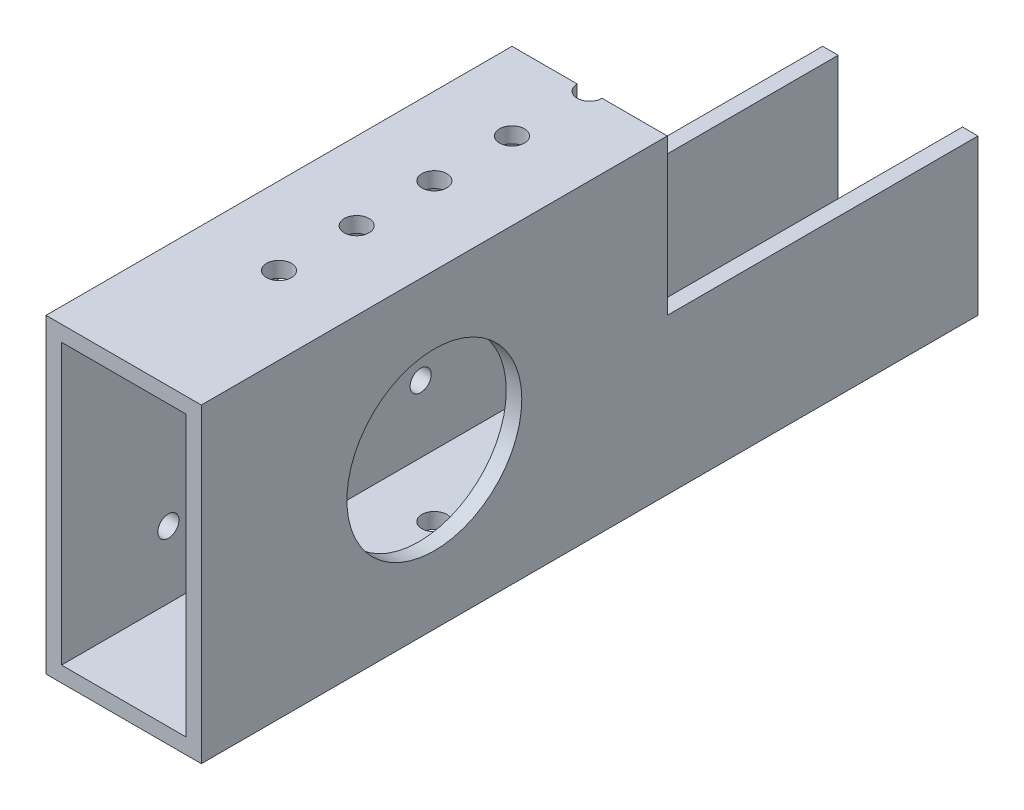
ISO-10303-21;
HEADER;
FILE_DESCRIPTION(('STEP AP214'),'2;1');
FILE_NAME('part.step','',(''),(''),'','','');
FILE_SCHEMA(('AUTOMOTIVE_DESIGN { 1 0 10303 214 1 1 1 1 }'));
ENDSEC;
DATA;
#1=APPLICATION_CONTEXT('core data for automotive mechanical design processes');
#2=APPLICATION_PROTOCOL_DEFINITION('international standard','automotive_design',2000,#1);
#3=PRODUCT_CONTEXT('',#1,'mechanical');
#4=PRODUCT('Part','Part','',(#3));
#5=PRODUCT_RELATED_PRODUCT_CATEGORY('part','',(#4));
#6=PRODUCT_DEFINITION_FORMATION('','',#4);
#7=PRODUCT_DEFINITION_CONTEXT('part definition',#1,'design');
#8=PRODUCT_DEFINITION('design','',#6,#7);
#9=PRODUCT_DEFINITION_SHAPE('','',#8);
#10=(LENGTH_UNIT() NAMED_UNIT(*) SI_UNIT(.MILLI.,.METRE.));
#11=(NAMED_UNIT(*) PLANE_ANGLE_UNIT() SI_UNIT($,.RADIAN.));
#12=(NAMED_UNIT(*) SI_UNIT($,.STERADIAN.) SOLID_ANGLE_UNIT());
#13=UNCERTAINTY_MEASURE_WITH_UNIT(LENGTH_MEASURE(1.E-05),#10,'distance_accuracy_value','');
#14=(GEOMETRIC_REPRESENTATION_CONTEXT(3) GLOBAL_UNCERTAINTY_ASSIGNED_CONTEXT((#13)) GLOBAL_UNIT_ASSIGNED_CONTEXT((#10,
#11,#12)) REPRESENTATION_CONTEXT('',''));
#15=CARTESIAN_POINT('',(0.,0.,0.));
#16=DIRECTION('',(0.,0.,1.));
#17=DIRECTION('',(1.,0.,0.));
#18=AXIS2_PLACEMENT_3D('',#15,#16,#17);
#19=CARTESIAN_POINT('',(-12.7,-25.4,127.));
#20=DIRECTION('',(1.,0.,0.));
#21=DIRECTION('',(0.,0.,-1.));
#22=AXIS2_PLACEMENT_3D('',#19,#20,#21);
#23=PLANE('',#22);
#24=CARTESIAN_POINT('',(-12.7,11.90625,68.2777700723832));
#25=DIRECTION('',(-1.,0.,0.));
#26=DIRECTION('',(0.,0.,1.));
#27=AXIS2_PLACEMENT_3D('',#24,#25,#26);
#28=CIRCLE('',#27,1.72719999999999);
#29=CARTESIAN_POINT('',(-12.7,11.90625,70.0049700723832));
#30=VERTEX_POINT('',#29);
#31=EDGE_CURVE('E392',#30,#30,#28,.T.);
#32=ORIENTED_EDGE('',*,*,#31,.F.);
#33=EDGE_LOOP('',(#32));
#34=FACE_BOUND('',#33,.T.);
#35=CARTESIAN_POINT('',(-12.7,0.,88.9));
#36=DIRECTION('',(1.,0.,0.));
#37=DIRECTION('',(0.,0.,-1.));
#38=AXIS2_PLACEMENT_3D('',#35,#36,#37);
#39=CIRCLE('',#38,14.3002);
#40=CARTESIAN_POINT('',(-12.7,0.,74.5998));
#41=VERTEX_POINT('',#40);
#42=EDGE_CURVE('E296',#41,#41,#39,.T.);
#43=ORIENTED_EDGE('',*,*,#42,.T.);
#44=EDGE_LOOP('',(#43));
#45=FACE_BOUND('',#44,.T.);
#46=DIRECTION('',(0.,0.,-1.));
#47=VECTOR('',#46,1.);
#48=CARTESIAN_POINT('',(-12.7,25.4,127.));
#49=LINE('',#48,#47);
#50=CARTESIAN_POINT('',(-12.7,25.4,127.));
#51=VERTEX_POINT('',#50);
#52=CARTESIAN_POINT('',(-12.7,25.4,50.8));
#53=VERTEX_POINT('',#52);
#54=EDGE_CURVE('E50',#51,#53,#49,.T.);
#55=ORIENTED_EDGE('',*,*,#54,.T.);
#56=DIRECTION('',(0.,1.,0.));
#57=VECTOR('',#56,1.);
#58=CARTESIAN_POINT('',(-12.7,25.4,50.8));
#59=LINE('',#58,#57);
#60=CARTESIAN_POINT('',(-12.7,0.,50.8));
#61=VERTEX_POINT('',#60);
#62=EDGE_CURVE('E375',#61,#53,#59,.T.);
#63=ORIENTED_EDGE('',*,*,#62,.F.);
#64=DIRECTION('',(0.,0.,1.));
#65=VECTOR('',#64,1.);
#66=CARTESIAN_POINT('',(-12.7,0.,0.));
#67=LINE('',#66,#65);
#68=CARTESIAN_POINT('',(-12.7,0.,0.));
#69=VERTEX_POINT('',#68);
#70=EDGE_CURVE('E380',#69,#61,#67,.T.);
#71=ORIENTED_EDGE('',*,*,#70,.F.);
#72=DIRECTION('',(0.,-1.,0.));
#73=VECTOR('',#72,1.);
#74=CARTESIAN_POINT('',(-12.7,-25.4,0.));
#75=LINE('',#74,#73);
#76=CARTESIAN_POINT('',(-12.7,-25.4,0.));
#77=VERTEX_POINT('',#76);
#78=EDGE_CURVE('E267',#69,#77,#75,.T.);
#79=ORIENTED_EDGE('',*,*,#78,.T.);
#80=DIRECTION('',(0.,0.,-1.));
#81=VECTOR('',#80,1.);
#82=CARTESIAN_POINT('',(-12.7,-25.4,127.));
#83=LINE('',#82,#81);
#84=CARTESIAN_POINT('',(-12.7,-25.4,127.));
#85=VERTEX_POINT('',#84);
#86=EDGE_CURVE('E272',#85,#77,#83,.T.);
#87=ORIENTED_EDGE('',*,*,#86,.F.);
#88=DIRECTION('',(0.,-1.,0.));
#89=VECTOR('',#88,1.);
#90=CARTESIAN_POINT('',(-12.7,-25.4,127.));
#91=LINE('',#90,#89);
#92=EDGE_CURVE('E260',#51,#85,#91,.T.);
#93=ORIENTED_EDGE('',*,*,#92,.F.);
#94=EDGE_LOOP('',(#55,#63,#71,#79,#87,#93));
#95=FACE_BOUND('',#94,.T.);
#96=CARTESIAN_POINT('',(-12.7,-11.90625,68.2777700723832));
#97=DIRECTION('',(-1.,0.,0.));
#98=DIRECTION('',(0.,0.,1.));
#99=AXIS2_PLACEMENT_3D('',#96,#97,#98);
#100=CIRCLE('',#99,1.72719999999999);
#101=CARTESIAN_POINT('',(-12.7,-11.90625,70.0049700723832));
#102=VERTEX_POINT('',#101);
#103=EDGE_CURVE('E398',#102,#102,#100,.T.);
#104=ORIENTED_EDGE('',*,*,#103,.F.);
#105=EDGE_LOOP('',(#104));
#106=FACE_BOUND('',#105,.T.);
#107=CARTESIAN_POINT('',(-12.7,-11.9062500000001,109.522229927617));
#108=DIRECTION('',(-1.,0.,0.));
#109=DIRECTION('',(0.,0.,1.));
#110=AXIS2_PLACEMENT_3D('',#107,#108,#109);
#111=CIRCLE('',#110,1.72719999999999);
#112=CARTESIAN_POINT('',(-12.7,-11.9062500000001,111.249429927617));
#113=VERTEX_POINT('',#112);
#114=EDGE_CURVE('E404',#113,#113,#111,.T.);
#115=ORIENTED_EDGE('',*,*,#114,.F.);
#116=EDGE_LOOP('',(#115));
#117=FACE_BOUND('',#116,.T.);
#118=CARTESIAN_POINT('',(-12.7,11.9062499999999,109.522229927617));
#119=DIRECTION('',(-1.,0.,0.));
#120=DIRECTION('',(0.,0.,1.));
#121=AXIS2_PLACEMENT_3D('',#118,#119,#120);
#122=CIRCLE('',#121,1.72719999999999);
#123=CARTESIAN_POINT('',(-12.7,11.9062499999999,111.249429927617));
#124=VERTEX_POINT('',#123);
#125=EDGE_CURVE('E410',#124,#124,#122,.T.);
#126=ORIENTED_EDGE('',*,*,#125,.F.);
#127=EDGE_LOOP('',(#126));
#128=FACE_BOUND('',#127,.T.);
#129=ADVANCED_FACE('F41',(#34,#45,#95,#106,#117,#128),#23,.F.);
#130=CARTESIAN_POINT('',(0.,0.,127.));
#131=DIRECTION('',(0.,0.,-1.));
#132=DIRECTION('',(-1.,0.,0.));
#133=AXIS2_PLACEMENT_3D('',#130,#131,#132);
#134=PLANE('',#133);
#135=DIRECTION('',(0.,1.,0.));
#136=VECTOR('',#135,1.);
#137=CARTESIAN_POINT('',(12.7,-25.4,127.));
#138=LINE('',#137,#136);
#139=CARTESIAN_POINT('',(12.7,-25.4,127.));
#140=VERTEX_POINT('',#139);
#141=CARTESIAN_POINT('',(12.7,25.4,127.));
#142=VERTEX_POINT('',#141);
#143=EDGE_CURVE('E254',#140,#142,#138,.T.);
#144=ORIENTED_EDGE('',*,*,#143,.T.);
#145=DIRECTION('',(-1.,0.,0.));
#146=VECTOR('',#145,1.);
#147=CARTESIAN_POINT('',(-12.7,25.4,127.));
#148=LINE('',#147,#146);
#149=EDGE_CURVE('E257',#142,#51,#148,.T.);
#150=ORIENTED_EDGE('',*,*,#149,.T.);
#151=ORIENTED_EDGE('',*,*,#92,.T.);
#152=DIRECTION('',(1.,0.,0.));
#153=VECTOR('',#152,1.);
#154=CARTESIAN_POINT('',(-12.7,-25.4,127.));
#155=LINE('',#154,#153);
#156=EDGE_CURVE('E262',#85,#140,#155,.T.);
#157=ORIENTED_EDGE('',*,*,#156,.T.);
#158=EDGE_LOOP('',(#144,#150,#151,#157));
#159=FACE_BOUND('',#158,.T.);
#160=DIRECTION('',(1.,0.,0.));
#161=VECTOR('',#160,1.);
#162=CARTESIAN_POINT('',(-10.16,-22.86,127.));
#163=LINE('',#162,#161);
#164=CARTESIAN_POINT('',(-10.16,-22.86,127.));
#165=VERTEX_POINT('',#164);
#166=CARTESIAN_POINT('',(10.16,-22.86,127.));
#167=VERTEX_POINT('',#166);
#168=EDGE_CURVE('E225',#165,#167,#163,.T.);
#169=ORIENTED_EDGE('',*,*,#168,.F.);
#170=DIRECTION('',(0.,-1.,0.));
#171=VECTOR('',#170,1.);
#172=CARTESIAN_POINT('',(-10.16,-22.86,127.));
#173=LINE('',#172,#171);
#174=CARTESIAN_POINT('',(-10.16,22.86,127.));
#175=VERTEX_POINT('',#174);
#176=EDGE_CURVE('E233',#175,#165,#173,.T.);
#177=ORIENTED_EDGE('',*,*,#176,.F.);
#178=DIRECTION('',(-1.,0.,0.));
#179=VECTOR('',#178,1.);
#180=CARTESIAN_POINT('',(-10.16,22.86,127.));
#181=LINE('',#180,#179);
#182=CARTESIAN_POINT('',(10.16,22.86,127.));
#183=VERTEX_POINT('',#182);
#184=EDGE_CURVE('E230',#183,#175,#181,.T.);
#185=ORIENTED_EDGE('',*,*,#184,.F.);
#186=DIRECTION('',(0.,1.,0.));
#187=VECTOR('',#186,1.);
#188=CARTESIAN_POINT('',(10.16,-22.86,127.));
#189=LINE('',#188,#187);
#190=EDGE_CURVE('E227',#167,#183,#189,.T.);
#191=ORIENTED_EDGE('',*,*,#190,.F.);
#192=EDGE_LOOP('',(#169,#177,#185,#191));
#193=FACE_BOUND('',#192,.T.);
#194=ADVANCED_FACE('F332',(#159,#193),#134,.F.);
#195=CARTESIAN_POINT('',(0.,0.,0.));
#196=DIRECTION('',(0.,0.,-1.));
#197=DIRECTION('',(-1.,0.,0.));
#198=AXIS2_PLACEMENT_3D('',#195,#196,#197);
#199=PLANE('',#198);
#200=DIRECTION('',(-1.,0.,0.));
#201=VECTOR('',#200,1.);
#202=CARTESIAN_POINT('',(12.701,0.,0.));
#203=LINE('',#202,#201);
#204=CARTESIAN_POINT('',(12.7,0.,0.));
#205=VERTEX_POINT('',#204);
#206=CARTESIAN_POINT('',(10.16,0.,0.));
#207=VERTEX_POINT('',#206);
#208=EDGE_CURVE('E374',#205,#207,#203,.T.);
#209=ORIENTED_EDGE('',*,*,#208,.F.);
#210=DIRECTION('',(0.,1.,0.));
#211=VECTOR('',#210,1.);
#212=CARTESIAN_POINT('',(12.7,-25.4,0.));
#213=LINE('',#212,#211);
#214=CARTESIAN_POINT('',(12.7,-25.4,0.));
#215=VERTEX_POINT('',#214);
#216=EDGE_CURVE('E253',#215,#205,#213,.T.);
#217=ORIENTED_EDGE('',*,*,#216,.F.);
#218=DIRECTION('',(1.,0.,0.));
#219=VECTOR('',#218,1.);
#220=CARTESIAN_POINT('',(-12.7,-25.4,0.));
#221=LINE('',#220,#219);
#222=EDGE_CURVE('E258',#77,#215,#221,.T.);
#223=ORIENTED_EDGE('',*,*,#222,.F.);
#224=ORIENTED_EDGE('',*,*,#78,.F.);
#225=CARTESIAN_POINT('',(-10.16,0.,0.));
#226=VERTEX_POINT('',#225);
#227=EDGE_CURVE('E372',#226,#69,#203,.T.);
#228=ORIENTED_EDGE('',*,*,#227,.F.);
#229=DIRECTION('',(0.,-1.,0.));
#230=VECTOR('',#229,1.);
#231=CARTESIAN_POINT('',(-10.16,-22.86,0.));
#232=LINE('',#231,#230);
#233=CARTESIAN_POINT('',(-10.16,-22.86,0.));
#234=VERTEX_POINT('',#233);
#235=EDGE_CURVE('E228',#226,#234,#232,.T.);
#236=ORIENTED_EDGE('',*,*,#235,.T.);
#237=DIRECTION('',(1.,0.,0.));
#238=VECTOR('',#237,1.);
#239=CARTESIAN_POINT('',(-10.16,-22.86,0.));
#240=LINE('',#239,#238);
#241=CARTESIAN_POINT('',(10.16,-22.86,0.));
#242=VERTEX_POINT('',#241);
#243=EDGE_CURVE('E224',#234,#242,#240,.T.);
#244=ORIENTED_EDGE('',*,*,#243,.T.);
#245=DIRECTION('',(0.,1.,0.));
#246=VECTOR('',#245,1.);
#247=CARTESIAN_POINT('',(10.16,-22.86,0.));
#248=LINE('',#247,#246);
#249=EDGE_CURVE('E238',#242,#207,#248,.T.);
#250=ORIENTED_EDGE('',*,*,#249,.T.);
#251=EDGE_LOOP('',(#209,#217,#223,#224,#228,#236,#244,#250));
#252=FACE_BOUND('',#251,.T.);
#253=ADVANCED_FACE('F340',(#252),#199,.T.);
#254=CARTESIAN_POINT('',(12.7,-25.4,127.));
#255=DIRECTION('',(-1.,0.,0.));
#256=DIRECTION('',(0.,0.,1.));
#257=AXIS2_PLACEMENT_3D('',#254,#255,#256);
#258=PLANE('',#257);
#259=CARTESIAN_POINT('',(12.7,0.,88.9));
#260=DIRECTION('',(1.,0.,0.));
#261=DIRECTION('',(0.,0.,-1.));
#262=AXIS2_PLACEMENT_3D('',#259,#260,#261);
#263=CIRCLE('',#262,14.3002);
#264=CARTESIAN_POINT('',(12.7,0.,74.5998));
#265=VERTEX_POINT('',#264);
#266=EDGE_CURVE('E294',#265,#265,#263,.T.);
#267=ORIENTED_EDGE('',*,*,#266,.F.);
#268=EDGE_LOOP('',(#267));
#269=FACE_BOUND('',#268,.T.);
#270=DIRECTION('',(0.,0.,-1.));
#271=VECTOR('',#270,1.);
#272=CARTESIAN_POINT('',(12.7,0.,0.));
#273=LINE('',#272,#271);
#274=CARTESIAN_POINT('',(12.7,0.,50.8));
#275=VERTEX_POINT('',#274);
#276=EDGE_CURVE('E292',#275,#205,#273,.T.);
#277=ORIENTED_EDGE('',*,*,#276,.F.);
#278=DIRECTION('',(0.,-1.,0.));
#279=VECTOR('',#278,1.);
#280=CARTESIAN_POINT('',(12.7,25.4,50.8));
#281=LINE('',#280,#279);
#282=CARTESIAN_POINT('',(12.7,25.4,50.8));
#283=VERTEX_POINT('',#282);
#284=EDGE_CURVE('E361',#283,#275,#281,.T.);
#285=ORIENTED_EDGE('',*,*,#284,.F.);
#286=DIRECTION('',(0.,0.,-1.));
#287=VECTOR('',#286,1.);
#288=CARTESIAN_POINT('',(12.7,25.4,127.));
#289=LINE('',#288,#287);
#290=EDGE_CURVE('E11',#142,#283,#289,.T.);
#291=ORIENTED_EDGE('',*,*,#290,.F.);
#292=ORIENTED_EDGE('',*,*,#143,.F.);
#293=DIRECTION('',(0.,0.,-1.));
#294=VECTOR('',#293,1.);
#295=CARTESIAN_POINT('',(12.7,-25.4,127.));
#296=LINE('',#295,#294);
#297=EDGE_CURVE('E264',#140,#215,#296,.T.);
#298=ORIENTED_EDGE('',*,*,#297,.T.);
#299=ORIENTED_EDGE('',*,*,#216,.T.);
#300=EDGE_LOOP('',(#277,#285,#291,#292,#298,#299));
#301=FACE_BOUND('',#300,.T.);
#302=ADVANCED_FACE('F43',(#269,#301),#258,.F.);
#303=CARTESIAN_POINT('',(-12.7,25.4,127.));
#304=DIRECTION('',(0.,-1.,0.));
#305=DIRECTION('',(0.,0.,-1.));
#306=AXIS2_PLACEMENT_3D('',#303,#304,#305);
#307=PLANE('',#306);
#308=ORIENTED_EDGE('',*,*,#290,.T.);
#309=DIRECTION('',(-1.,0.,0.));
#310=VECTOR('',#309,1.);
#311=CARTESIAN_POINT('',(12.701,25.4,50.8));
#312=LINE('',#311,#310);
#313=CARTESIAN_POINT('',(2.032,25.4,50.8));
#314=VERTEX_POINT('',#313);
#315=EDGE_CURVE('E145',#283,#314,#312,.T.);
#316=ORIENTED_EDGE('',*,*,#315,.T.);
#317=CARTESIAN_POINT('',(0.,25.4,50.8));
#318=DIRECTION('',(0.,1.,0.));
#319=DIRECTION('',(0.,0.,1.));
#320=AXIS2_PLACEMENT_3D('',#317,#318,#319);
#321=CIRCLE('',#320,2.032);
#322=CARTESIAN_POINT('',(-2.032,25.4,50.8));
#323=VERTEX_POINT('',#322);
#324=EDGE_CURVE('E157',#323,#314,#321,.T.);
#325=ORIENTED_EDGE('',*,*,#324,.F.);
#326=EDGE_CURVE('E58',#323,#53,#312,.T.);
#327=ORIENTED_EDGE('',*,*,#326,.T.);
#328=ORIENTED_EDGE('',*,*,#54,.F.);
#329=ORIENTED_EDGE('',*,*,#149,.F.);
#330=EDGE_LOOP('',(#308,#316,#325,#327,#328,#329));
#331=FACE_BOUND('',#330,.T.);
#332=CARTESIAN_POINT('',(0.,25.4,63.5));
#333=DIRECTION('',(0.,1.,0.));
#334=DIRECTION('',(0.,0.,1.));
#335=AXIS2_PLACEMENT_3D('',#332,#333,#334);
#336=CIRCLE('',#335,2.032);
#337=CARTESIAN_POINT('',(0.,25.4,65.532));
#338=VERTEX_POINT('',#337);
#339=EDGE_CURVE('E170',#338,#338,#336,.T.);
#340=ORIENTED_EDGE('',*,*,#339,.F.);
#341=EDGE_LOOP('',(#340));
#342=FACE_BOUND('',#341,.T.);
#343=CARTESIAN_POINT('',(0.,25.4,76.2));
#344=DIRECTION('',(0.,1.,0.));
#345=DIRECTION('',(0.,0.,1.));
#346=AXIS2_PLACEMENT_3D('',#343,#344,#345);
#347=CIRCLE('',#346,2.032);
#348=CARTESIAN_POINT('',(0.,25.4,78.232));
#349=VERTEX_POINT('',#348);
#350=EDGE_CURVE('E179',#349,#349,#347,.T.);
#351=ORIENTED_EDGE('',*,*,#350,.F.);
#352=EDGE_LOOP('',(#351));
#353=FACE_BOUND('',#352,.T.);
#354=CARTESIAN_POINT('',(0.,25.4,88.9));
#355=DIRECTION('',(0.,1.,0.));
#356=DIRECTION('',(0.,0.,1.));
#357=AXIS2_PLACEMENT_3D('',#354,#355,#356);
#358=CIRCLE('',#357,2.032);
#359=CARTESIAN_POINT('',(0.,25.4,90.932));
#360=VERTEX_POINT('',#359);
#361=EDGE_CURVE('E185',#360,#360,#358,.T.);
#362=ORIENTED_EDGE('',*,*,#361,.F.);
#363=EDGE_LOOP('',(#362));
#364=FACE_BOUND('',#363,.T.);
#365=CARTESIAN_POINT('',(0.,25.4,101.6));
#366=DIRECTION('',(0.,1.,0.));
#367=DIRECTION('',(0.,0.,1.));
#368=AXIS2_PLACEMENT_3D('',#365,#366,#367);
#369=CIRCLE('',#368,2.032);
#370=CARTESIAN_POINT('',(0.,25.4,103.632));
#371=VERTEX_POINT('',#370);
#372=EDGE_CURVE('E191',#371,#371,#369,.T.);
#373=ORIENTED_EDGE('',*,*,#372,.F.);
#374=EDGE_LOOP('',(#373));
#375=FACE_BOUND('',#374,.T.);
#376=ADVANCED_FACE('F155',(#331,#342,#353,#364,#375),#307,.F.);
#377=CARTESIAN_POINT('',(-12.7,-25.4,127.));
#378=DIRECTION('',(0.,1.,0.));
#379=DIRECTION('',(0.,0.,1.));
#380=AXIS2_PLACEMENT_3D('',#377,#378,#379);
#381=PLANE('',#380);
#382=CARTESIAN_POINT('',(0.,-25.4,12.7));
#383=DIRECTION('',(0.,1.,0.));
#384=DIRECTION('',(0.,0.,1.));
#385=AXIS2_PLACEMENT_3D('',#382,#383,#384);
#386=CIRCLE('',#385,2.032);
#387=CARTESIAN_POINT('',(0.,-25.4,14.732));
#388=VERTEX_POINT('',#387);
#389=EDGE_CURVE('E279',#388,#388,#386,.T.);
#390=ORIENTED_EDGE('',*,*,#389,.T.);
#391=EDGE_LOOP('',(#390));
#392=FACE_BOUND('',#391,.T.);
#393=CARTESIAN_POINT('',(0.,-25.4,25.4));
#394=DIRECTION('',(0.,1.,0.));
#395=DIRECTION('',(0.,0.,1.));
#396=AXIS2_PLACEMENT_3D('',#393,#394,#395);
#397=CIRCLE('',#396,2.032);
#398=CARTESIAN_POINT('',(0.,-25.4,27.432));
#399=VERTEX_POINT('',#398);
#400=EDGE_CURVE('E307',#399,#399,#397,.T.);
#401=ORIENTED_EDGE('',*,*,#400,.T.);
#402=EDGE_LOOP('',(#401));
#403=FACE_BOUND('',#402,.T.);
#404=CARTESIAN_POINT('',(0.,-25.4,38.1));
#405=DIRECTION('',(0.,1.,0.));
#406=DIRECTION('',(0.,0.,1.));
#407=AXIS2_PLACEMENT_3D('',#404,#405,#406);
#408=CIRCLE('',#407,2.032);
#409=CARTESIAN_POINT('',(0.,-25.4,40.132));
#410=VERTEX_POINT('',#409);
#411=EDGE_CURVE('E167',#410,#410,#408,.T.);
#412=ORIENTED_EDGE('',*,*,#411,.T.);
#413=EDGE_LOOP('',(#412));
#414=FACE_BOUND('',#413,.T.);
#415=CARTESIAN_POINT('',(0.,-25.4,50.8));
#416=DIRECTION('',(0.,1.,0.));
#417=DIRECTION('',(0.,0.,1.));
#418=AXIS2_PLACEMENT_3D('',#415,#416,#417);
#419=CIRCLE('',#418,2.032);
#420=CARTESIAN_POINT('',(0.,-25.4,52.832));
#421=VERTEX_POINT('',#420);
#422=EDGE_CURVE('E163',#421,#421,#419,.T.);
#423=ORIENTED_EDGE('',*,*,#422,.T.);
#424=EDGE_LOOP('',(#423));
#425=FACE_BOUND('',#424,.T.);
#426=CARTESIAN_POINT('',(0.,-25.4,63.5));
#427=DIRECTION('',(0.,1.,0.));
#428=DIRECTION('',(0.,0.,1.));
#429=AXIS2_PLACEMENT_3D('',#426,#427,#428);
#430=CIRCLE('',#429,2.032);
#431=CARTESIAN_POINT('',(0.,-25.4,65.532));
#432=VERTEX_POINT('',#431);
#433=EDGE_CURVE('E164',#432,#432,#430,.T.);
#434=ORIENTED_EDGE('',*,*,#433,.T.);
#435=EDGE_LOOP('',(#434));
#436=FACE_BOUND('',#435,.T.);
#437=CARTESIAN_POINT('',(0.,-25.4,76.2));
#438=DIRECTION('',(0.,1.,0.));
#439=DIRECTION('',(0.,0.,1.));
#440=AXIS2_PLACEMENT_3D('',#437,#438,#439);
#441=CIRCLE('',#440,2.032);
#442=CARTESIAN_POINT('',(0.,-25.4,78.232));
#443=VERTEX_POINT('',#442);
#444=EDGE_CURVE('E176',#443,#443,#441,.T.);
#445=ORIENTED_EDGE('',*,*,#444,.T.);
#446=EDGE_LOOP('',(#445));
#447=FACE_BOUND('',#446,.T.);
#448=CARTESIAN_POINT('',(0.,-25.4,88.9));
#449=DIRECTION('',(0.,1.,0.));
#450=DIRECTION('',(0.,0.,1.));
#451=AXIS2_PLACEMENT_3D('',#448,#449,#450);
#452=CIRCLE('',#451,2.032);
#453=CARTESIAN_POINT('',(0.,-25.4,90.932));
#454=VERTEX_POINT('',#453);
#455=EDGE_CURVE('E182',#454,#454,#452,.T.);
#456=ORIENTED_EDGE('',*,*,#455,.T.);
#457=EDGE_LOOP('',(#456));
#458=FACE_BOUND('',#457,.T.);
#459=CARTESIAN_POINT('',(0.,-25.4,101.6));
#460=DIRECTION('',(0.,1.,0.));
#461=DIRECTION('',(0.,0.,1.));
#462=AXIS2_PLACEMENT_3D('',#459,#460,#461);
#463=CIRCLE('',#462,2.032);
#464=CARTESIAN_POINT('',(0.,-25.4,103.632));
#465=VERTEX_POINT('',#464);
#466=EDGE_CURVE('E188',#465,#465,#463,.T.);
#467=ORIENTED_EDGE('',*,*,#466,.T.);
#468=EDGE_LOOP('',(#467));
#469=FACE_BOUND('',#468,.T.);
#470=ORIENTED_EDGE('',*,*,#222,.T.);
#471=ORIENTED_EDGE('',*,*,#297,.F.);
#472=ORIENTED_EDGE('',*,*,#156,.F.);
#473=ORIENTED_EDGE('',*,*,#86,.T.);
#474=EDGE_LOOP('',(#470,#471,#472,#473));
#475=FACE_BOUND('',#474,.T.);
#476=ADVANCED_FACE('F312',(#392,#403,#414,#425,#436,#447,#458,#469,#475),#381,.F.);
#477=CARTESIAN_POINT('',(-10.16,-22.86,127.));
#478=DIRECTION('',(0.,1.,0.));
#479=DIRECTION('',(0.,0.,1.));
#480=AXIS2_PLACEMENT_3D('',#477,#478,#479);
#481=PLANE('',#480);
#482=CARTESIAN_POINT('',(0.,-22.86,12.7));
#483=DIRECTION('',(0.,1.,0.));
#484=DIRECTION('',(0.,0.,1.));
#485=AXIS2_PLACEMENT_3D('',#482,#483,#484);
#486=CIRCLE('',#485,2.032);
#487=CARTESIAN_POINT('',(0.,-22.86,14.732));
#488=VERTEX_POINT('',#487);
#489=EDGE_CURVE('E221',#488,#488,#486,.T.);
#490=ORIENTED_EDGE('',*,*,#489,.F.);
#491=EDGE_LOOP('',(#490));
#492=FACE_BOUND('',#491,.T.);
#493=CARTESIAN_POINT('',(0.,-22.86,25.4));
#494=DIRECTION('',(0.,1.,0.));
#495=DIRECTION('',(0.,0.,1.));
#496=AXIS2_PLACEMENT_3D('',#493,#494,#495);
#497=CIRCLE('',#496,2.032);
#498=CARTESIAN_POINT('',(0.,-22.86,27.432));
#499=VERTEX_POINT('',#498);
#500=EDGE_CURVE('E218',#499,#499,#497,.T.);
#501=ORIENTED_EDGE('',*,*,#500,.F.);
#502=EDGE_LOOP('',(#501));
#503=FACE_BOUND('',#502,.T.);
#504=CARTESIAN_POINT('',(0.,-22.86,38.1));
#505=DIRECTION('',(0.,1.,0.));
#506=DIRECTION('',(0.,0.,1.));
#507=AXIS2_PLACEMENT_3D('',#504,#505,#506);
#508=CIRCLE('',#507,2.032);
#509=CARTESIAN_POINT('',(0.,-22.86,40.132));
#510=VERTEX_POINT('',#509);
#511=EDGE_CURVE('E215',#510,#510,#508,.T.);
#512=ORIENTED_EDGE('',*,*,#511,.F.);
#513=EDGE_LOOP('',(#512));
#514=FACE_BOUND('',#513,.T.);
#515=CARTESIAN_POINT('',(0.,-22.86,50.8));
#516=DIRECTION('',(0.,1.,0.));
#517=DIRECTION('',(0.,0.,1.));
#518=AXIS2_PLACEMENT_3D('',#515,#516,#517);
#519=CIRCLE('',#518,2.032);
#520=CARTESIAN_POINT('',(0.,-22.86,52.832));
#521=VERTEX_POINT('',#520);
#522=EDGE_CURVE('E212',#521,#521,#519,.T.);
#523=ORIENTED_EDGE('',*,*,#522,.F.);
#524=EDGE_LOOP('',(#523));
#525=FACE_BOUND('',#524,.T.);
#526=CARTESIAN_POINT('',(0.,-22.86,63.5));
#527=DIRECTION('',(0.,1.,0.));
#528=DIRECTION('',(0.,0.,1.));
#529=AXIS2_PLACEMENT_3D('',#526,#527,#528);
#530=CIRCLE('',#529,2.032);
#531=CARTESIAN_POINT('',(0.,-22.86,65.532));
#532=VERTEX_POINT('',#531);
#533=EDGE_CURVE('E208',#532,#532,#530,.T.);
#534=ORIENTED_EDGE('',*,*,#533,.F.);
#535=EDGE_LOOP('',(#534));
#536=FACE_BOUND('',#535,.T.);
#537=CARTESIAN_POINT('',(0.,-22.86,76.2));
#538=DIRECTION('',(0.,1.,0.));
#539=DIRECTION('',(0.,0.,1.));
#540=AXIS2_PLACEMENT_3D('',#537,#538,#539);
#541=CIRCLE('',#540,2.032);
#542=CARTESIAN_POINT('',(0.,-22.86,78.232));
#543=VERTEX_POINT('',#542);
#544=EDGE_CURVE('E204',#543,#543,#541,.T.);
#545=ORIENTED_EDGE('',*,*,#544,.F.);
#546=EDGE_LOOP('',(#545));
#547=FACE_BOUND('',#546,.T.);
#548=CARTESIAN_POINT('',(0.,-22.86,88.9));
#549=DIRECTION('',(0.,1.,0.));
#550=DIRECTION('',(0.,0.,1.));
#551=AXIS2_PLACEMENT_3D('',#548,#549,#550);
#552=CIRCLE('',#551,2.032);
#553=CARTESIAN_POINT('',(0.,-22.86,90.932));
#554=VERTEX_POINT('',#553);
#555=EDGE_CURVE('E200',#554,#554,#552,.T.);
#556=ORIENTED_EDGE('',*,*,#555,.F.);
#557=EDGE_LOOP('',(#556));
#558=FACE_BOUND('',#557,.T.);
#559=CARTESIAN_POINT('',(0.,-22.86,101.6));
#560=DIRECTION('',(0.,1.,0.));
#561=DIRECTION('',(0.,0.,1.));
#562=AXIS2_PLACEMENT_3D('',#559,#560,#561);
#563=CIRCLE('',#562,2.032);
#564=CARTESIAN_POINT('',(0.,-22.86,103.632));
#565=VERTEX_POINT('',#564);
#566=EDGE_CURVE('E195',#565,#565,#563,.T.);
#567=ORIENTED_EDGE('',*,*,#566,.F.);
#568=EDGE_LOOP('',(#567));
#569=FACE_BOUND('',#568,.T.);
#570=ORIENTED_EDGE('',*,*,#243,.F.);
#571=DIRECTION('',(0.,0.,-1.));
#572=VECTOR('',#571,1.);
#573=CARTESIAN_POINT('',(-10.16,-22.86,127.));
#574=LINE('',#573,#572);
#575=EDGE_CURVE('E235',#165,#234,#574,.T.);
#576=ORIENTED_EDGE('',*,*,#575,.F.);
#577=ORIENTED_EDGE('',*,*,#168,.T.);
#578=DIRECTION('',(0.,0.,-1.));
#579=VECTOR('',#578,1.);
#580=CARTESIAN_POINT('',(10.16,-22.86,127.));
#581=LINE('',#580,#579);
#582=EDGE_CURVE('E250',#167,#242,#581,.T.);
#583=ORIENTED_EDGE('',*,*,#582,.T.);
#584=EDGE_LOOP('',(#570,#576,#577,#583));
#585=FACE_BOUND('',#584,.T.);
#586=ADVANCED_FACE('F352',(#492,#503,#514,#525,#536,#547,#558,#569,#585),#481,.T.);
#587=CARTESIAN_POINT('',(10.16,-22.86,127.));
#588=DIRECTION('',(-1.,0.,0.));
#589=DIRECTION('',(0.,0.,1.));
#590=AXIS2_PLACEMENT_3D('',#587,#588,#589);
#591=PLANE('',#590);
#592=DIRECTION('',(0.,-1.,0.));
#593=VECTOR('',#592,1.);
#594=CARTESIAN_POINT('',(10.16,25.4,50.8));
#595=LINE('',#594,#593);
#596=CARTESIAN_POINT('',(10.16,22.86,50.8));
#597=VERTEX_POINT('',#596);
#598=CARTESIAN_POINT('',(10.16,0.,50.8));
#599=VERTEX_POINT('',#598);
#600=EDGE_CURVE('E384',#597,#599,#595,.T.);
#601=ORIENTED_EDGE('',*,*,#600,.T.);
#602=DIRECTION('',(0.,0.,-1.));
#603=VECTOR('',#602,1.);
#604=CARTESIAN_POINT('',(10.16,0.,0.));
#605=LINE('',#604,#603);
#606=EDGE_CURVE('E365',#599,#207,#605,.T.);
#607=ORIENTED_EDGE('',*,*,#606,.T.);
#608=ORIENTED_EDGE('',*,*,#249,.F.);
#609=ORIENTED_EDGE('',*,*,#582,.F.);
#610=ORIENTED_EDGE('',*,*,#190,.T.);
#611=DIRECTION('',(0.,0.,-1.));
#612=VECTOR('',#611,1.);
#613=CARTESIAN_POINT('',(10.16,22.86,127.));
#614=LINE('',#613,#612);
#615=EDGE_CURVE('E247',#183,#597,#614,.T.);
#616=ORIENTED_EDGE('',*,*,#615,.T.);
#617=EDGE_LOOP('',(#601,#607,#608,#609,#610,#616));
#618=FACE_BOUND('',#617,.T.);
#619=CARTESIAN_POINT('',(10.16,0.,88.9));
#620=DIRECTION('',(-1.,0.,0.));
#621=DIRECTION('',(0.,0.,1.));
#622=AXIS2_PLACEMENT_3D('',#619,#620,#621);
#623=CIRCLE('',#622,14.3002);
#624=CARTESIAN_POINT('',(10.16,0.,103.2002));
#625=VERTEX_POINT('',#624);
#626=EDGE_CURVE('E194',#625,#625,#623,.T.);
#627=ORIENTED_EDGE('',*,*,#626,.F.);
#628=EDGE_LOOP('',(#627));
#629=FACE_BOUND('',#628,.T.);
#630=ADVANCED_FACE('F486',(#618,#629),#591,.T.);
#631=CARTESIAN_POINT('',(-10.16,22.86,127.));
#632=DIRECTION('',(0.,-1.,0.));
#633=DIRECTION('',(0.,0.,-1.));
#634=AXIS2_PLACEMENT_3D('',#631,#632,#633);
#635=PLANE('',#634);
#636=DIRECTION('',(1.,0.,0.));
#637=VECTOR('',#636,1.);
#638=CARTESIAN_POINT('',(12.701,22.86,50.8));
#639=LINE('',#638,#637);
#640=CARTESIAN_POINT('',(2.032,22.86,50.8));
#641=VERTEX_POINT('',#640);
#642=EDGE_CURVE('E66',#641,#597,#639,.T.);
#643=ORIENTED_EDGE('',*,*,#642,.T.);
#644=ORIENTED_EDGE('',*,*,#615,.F.);
#645=ORIENTED_EDGE('',*,*,#184,.T.);
#646=DIRECTION('',(0.,0.,-1.));
#647=VECTOR('',#646,1.);
#648=CARTESIAN_POINT('',(-10.16,22.86,127.));
#649=LINE('',#648,#647);
#650=CARTESIAN_POINT('',(-10.16,22.86,50.8));
#651=VERTEX_POINT('',#650);
#652=EDGE_CURVE('E244',#175,#651,#649,.T.);
#653=ORIENTED_EDGE('',*,*,#652,.T.);
#654=CARTESIAN_POINT('',(-2.032,22.86,50.8));
#655=VERTEX_POINT('',#654);
#656=EDGE_CURVE('E151',#651,#655,#639,.T.);
#657=ORIENTED_EDGE('',*,*,#656,.T.);
#658=CARTESIAN_POINT('',(0.,22.86,50.8));
#659=DIRECTION('',(0.,-1.,0.));
#660=DIRECTION('',(0.,0.,-1.));
#661=AXIS2_PLACEMENT_3D('',#658,#659,#660);
#662=CIRCLE('',#661,2.032);
#663=EDGE_CURVE('E211',#641,#655,#662,.T.);
#664=ORIENTED_EDGE('',*,*,#663,.F.);
#665=EDGE_LOOP('',(#643,#644,#645,#653,#657,#664));
#666=FACE_BOUND('',#665,.T.);
#667=CARTESIAN_POINT('',(0.,22.86,63.5));
#668=DIRECTION('',(0.,-1.,0.));
#669=DIRECTION('',(0.,0.,-1.));
#670=AXIS2_PLACEMENT_3D('',#667,#668,#669);
#671=CIRCLE('',#670,2.032);
#672=CARTESIAN_POINT('',(0.,22.86,61.468));
#673=VERTEX_POINT('',#672);
#674=EDGE_CURVE('E207',#673,#673,#671,.T.);
#675=ORIENTED_EDGE('',*,*,#674,.F.);
#676=EDGE_LOOP('',(#675));
#677=FACE_BOUND('',#676,.T.);
#678=CARTESIAN_POINT('',(0.,22.86,76.2));
#679=DIRECTION('',(0.,-1.,0.));
#680=DIRECTION('',(0.,0.,-1.));
#681=AXIS2_PLACEMENT_3D('',#678,#679,#680);
#682=CIRCLE('',#681,2.032);
#683=CARTESIAN_POINT('',(0.,22.86,74.168));
#684=VERTEX_POINT('',#683);
#685=EDGE_CURVE('E203',#684,#684,#682,.T.);
#686=ORIENTED_EDGE('',*,*,#685,.F.);
#687=EDGE_LOOP('',(#686));
#688=FACE_BOUND('',#687,.T.);
#689=CARTESIAN_POINT('',(0.,22.86,88.9));
#690=DIRECTION('',(0.,-1.,0.));
#691=DIRECTION('',(0.,0.,-1.));
#692=AXIS2_PLACEMENT_3D('',#689,#690,#691);
#693=CIRCLE('',#692,2.032);
#694=CARTESIAN_POINT('',(0.,22.86,86.868));
#695=VERTEX_POINT('',#694);
#696=EDGE_CURVE('E198',#695,#695,#693,.T.);
#697=ORIENTED_EDGE('',*,*,#696,.F.);
#698=EDGE_LOOP('',(#697));
#699=FACE_BOUND('',#698,.T.);
#700=CARTESIAN_POINT('',(0.,22.86,101.6));
#701=DIRECTION('',(0.,-1.,0.));
#702=DIRECTION('',(0.,0.,-1.));
#703=AXIS2_PLACEMENT_3D('',#700,#701,#702);
#704=CIRCLE('',#703,2.032);
#705=CARTESIAN_POINT('',(0.,22.86,99.568));
#706=VERTEX_POINT('',#705);
#707=EDGE_CURVE('E199',#706,#706,#704,.T.);
#708=ORIENTED_EDGE('',*,*,#707,.F.);
#709=EDGE_LOOP('',(#708));
#710=FACE_BOUND('',#709,.T.);
#711=ADVANCED_FACE('F287',(#666,#677,#688,#699,#710),#635,.T.);
#712=CARTESIAN_POINT('',(-10.16,-22.86,127.));
#713=DIRECTION('',(1.,0.,0.));
#714=DIRECTION('',(0.,0.,-1.));
#715=AXIS2_PLACEMENT_3D('',#712,#713,#714);
#716=PLANE('',#715);
#717=CARTESIAN_POINT('',(-10.16,11.9062499999999,109.522229927617));
#718=DIRECTION('',(1.,0.,0.));
#719=DIRECTION('',(0.,0.,-1.));
#720=AXIS2_PLACEMENT_3D('',#717,#718,#719);
#721=CIRCLE('',#720,1.72719999999999);
#722=CARTESIAN_POINT('',(-10.16,11.9062499999999,107.795029927617));
#723=VERTEX_POINT('',#722);
#724=EDGE_CURVE('E407',#723,#723,#721,.T.);
#725=ORIENTED_EDGE('',*,*,#724,.F.);
#726=EDGE_LOOP('',(#725));
#727=FACE_BOUND('',#726,.T.);
#728=CARTESIAN_POINT('',(-10.16,-11.9062500000001,109.522229927617));
#729=DIRECTION('',(1.,0.,0.));
#730=DIRECTION('',(0.,0.,-1.));
#731=AXIS2_PLACEMENT_3D('',#728,#729,#730);
#732=CIRCLE('',#731,1.72719999999999);
#733=CARTESIAN_POINT('',(-10.16,-11.9062500000001,107.795029927617));
#734=VERTEX_POINT('',#733);
#735=EDGE_CURVE('E401',#734,#734,#732,.T.);
#736=ORIENTED_EDGE('',*,*,#735,.F.);
#737=EDGE_LOOP('',(#736));
#738=FACE_BOUND('',#737,.T.);
#739=CARTESIAN_POINT('',(-10.16,-11.90625,68.2777700723832));
#740=DIRECTION('',(1.,0.,0.));
#741=DIRECTION('',(0.,0.,-1.));
#742=AXIS2_PLACEMENT_3D('',#739,#740,#741);
#743=CIRCLE('',#742,1.72719999999999);
#744=CARTESIAN_POINT('',(-10.16,-11.90625,66.5505700723832));
#745=VERTEX_POINT('',#744);
#746=EDGE_CURVE('E395',#745,#745,#743,.T.);
#747=ORIENTED_EDGE('',*,*,#746,.F.);
#748=EDGE_LOOP('',(#747));
#749=FACE_BOUND('',#748,.T.);
#750=CARTESIAN_POINT('',(-10.16,11.90625,68.2777700723832));
#751=DIRECTION('',(1.,0.,0.));
#752=DIRECTION('',(0.,0.,-1.));
#753=AXIS2_PLACEMENT_3D('',#750,#751,#752);
#754=CIRCLE('',#753,1.72719999999999);
#755=CARTESIAN_POINT('',(-10.16,11.90625,66.5505700723832));
#756=VERTEX_POINT('',#755);
#757=EDGE_CURVE('E389',#756,#756,#754,.T.);
#758=ORIENTED_EDGE('',*,*,#757,.F.);
#759=EDGE_LOOP('',(#758));
#760=FACE_BOUND('',#759,.T.);
#761=DIRECTION('',(0.,1.,0.));
#762=VECTOR('',#761,1.);
#763=CARTESIAN_POINT('',(-10.16,25.4,50.8));
#764=LINE('',#763,#762);
#765=CARTESIAN_POINT('',(-10.16,0.,50.8));
#766=VERTEX_POINT('',#765);
#767=EDGE_CURVE('E387',#766,#651,#764,.T.);
#768=ORIENTED_EDGE('',*,*,#767,.T.);
#769=ORIENTED_EDGE('',*,*,#652,.F.);
#770=ORIENTED_EDGE('',*,*,#176,.T.);
#771=ORIENTED_EDGE('',*,*,#575,.T.);
#772=ORIENTED_EDGE('',*,*,#235,.F.);
#773=DIRECTION('',(0.,0.,1.));
#774=VECTOR('',#773,1.);
#775=CARTESIAN_POINT('',(-10.16,0.,0.));
#776=LINE('',#775,#774);
#777=EDGE_CURVE('E159',#226,#766,#776,.T.);
#778=ORIENTED_EDGE('',*,*,#777,.T.);
#779=EDGE_LOOP('',(#768,#769,#770,#771,#772,#778));
#780=FACE_BOUND('',#779,.T.);
#781=CARTESIAN_POINT('',(-10.16,0.,88.9));
#782=DIRECTION('',(1.,0.,0.));
#783=DIRECTION('',(0.,0.,-1.));
#784=AXIS2_PLACEMENT_3D('',#781,#782,#783);
#785=CIRCLE('',#784,14.3002);
#786=CARTESIAN_POINT('',(-10.16,0.,74.5998));
#787=VERTEX_POINT('',#786);
#788=EDGE_CURVE('E45',#787,#787,#785,.T.);
#789=ORIENTED_EDGE('',*,*,#788,.F.);
#790=EDGE_LOOP('',(#789));
#791=FACE_BOUND('',#790,.T.);
#792=ADVANCED_FACE('F422',(#727,#738,#749,#760,#780,#791),#716,.T.);
#793=CARTESIAN_POINT('',(0.,-25.4,101.6));
#794=DIRECTION('',(0.,1.,0.));
#795=DIRECTION('',(0.,0.,1.));
#796=AXIS2_PLACEMENT_3D('',#793,#794,#795);
#797=CYLINDRICAL_SURFACE('',#796,2.032);
#798=ORIENTED_EDGE('',*,*,#707,.T.);
#799=EDGE_LOOP('',(#798));
#800=FACE_BOUND('',#799,.T.);
#801=ORIENTED_EDGE('',*,*,#372,.T.);
#802=EDGE_LOOP('',(#801));
#803=FACE_BOUND('',#802,.T.);
#804=ADVANCED_FACE('F424',(#800,#803),#797,.F.);
#805=CARTESIAN_POINT('',(0.,-25.4,88.9));
#806=DIRECTION('',(0.,1.,0.));
#807=DIRECTION('',(0.,0.,1.));
#808=AXIS2_PLACEMENT_3D('',#805,#806,#807);
#809=CYLINDRICAL_SURFACE('',#808,2.032);
#810=ORIENTED_EDGE('',*,*,#696,.T.);
#811=EDGE_LOOP('',(#810));
#812=FACE_BOUND('',#811,.T.);
#813=ORIENTED_EDGE('',*,*,#361,.T.);
#814=EDGE_LOOP('',(#813));
#815=FACE_BOUND('',#814,.T.);
#816=ADVANCED_FACE('F595',(#812,#815),#809,.F.);
#817=CARTESIAN_POINT('',(0.,-25.4,76.2));
#818=DIRECTION('',(0.,1.,0.));
#819=DIRECTION('',(0.,0.,1.));
#820=AXIS2_PLACEMENT_3D('',#817,#818,#819);
#821=CYLINDRICAL_SURFACE('',#820,2.032);
#822=ORIENTED_EDGE('',*,*,#685,.T.);
#823=EDGE_LOOP('',(#822));
#824=FACE_BOUND('',#823,.T.);
#825=ORIENTED_EDGE('',*,*,#350,.T.);
#826=EDGE_LOOP('',(#825));
#827=FACE_BOUND('',#826,.T.);
#828=ADVANCED_FACE('F584',(#824,#827),#821,.F.);
#829=CARTESIAN_POINT('',(0.,-25.4,63.5));
#830=DIRECTION('',(0.,1.,0.));
#831=DIRECTION('',(0.,0.,1.));
#832=AXIS2_PLACEMENT_3D('',#829,#830,#831);
#833=CYLINDRICAL_SURFACE('',#832,2.032);
#834=ORIENTED_EDGE('',*,*,#674,.T.);
#835=EDGE_LOOP('',(#834));
#836=FACE_BOUND('',#835,.T.);
#837=ORIENTED_EDGE('',*,*,#339,.T.);
#838=EDGE_LOOP('',(#837));
#839=FACE_BOUND('',#838,.T.);
#840=ADVANCED_FACE('F573',(#836,#839),#833,.F.);
#841=CARTESIAN_POINT('',(0.,-25.4,50.8));
#842=DIRECTION('',(0.,1.,0.));
#843=DIRECTION('',(0.,0.,1.));
#844=AXIS2_PLACEMENT_3D('',#841,#842,#843);
#845=CYLINDRICAL_SURFACE('',#844,2.032);
#846=ORIENTED_EDGE('',*,*,#324,.T.);
#847=DIRECTION('',(0.,1.,0.));
#848=VECTOR('',#847,1.);
#849=CARTESIAN_POINT('',(2.032,-25.4,50.8));
#850=LINE('',#849,#848);
#851=EDGE_CURVE('E141',#641,#314,#850,.T.);
#852=ORIENTED_EDGE('',*,*,#851,.F.);
#853=ORIENTED_EDGE('',*,*,#663,.T.);
#854=DIRECTION('',(0.,1.,0.));
#855=VECTOR('',#854,1.);
#856=CARTESIAN_POINT('',(-2.032,-25.4,50.8));
#857=LINE('',#856,#855);
#858=EDGE_CURVE('E162',#323,#655,#857,.F.);
#859=ORIENTED_EDGE('',*,*,#858,.F.);
#860=EDGE_LOOP('',(#846,#852,#853,#859));
#861=FACE_BOUND('',#860,.T.);
#862=ADVANCED_FACE('F161',(#861),#845,.F.);
#863=ORIENTED_EDGE('',*,*,#566,.T.);
#864=EDGE_LOOP('',(#863));
#865=FACE_BOUND('',#864,.T.);
#866=ORIENTED_EDGE('',*,*,#466,.F.);
#867=EDGE_LOOP('',(#866));
#868=FACE_BOUND('',#867,.T.);
#869=ADVANCED_FACE('F592',(#865,#868),#797,.F.);
#870=ORIENTED_EDGE('',*,*,#555,.T.);
#871=EDGE_LOOP('',(#870));
#872=FACE_BOUND('',#871,.T.);
#873=ORIENTED_EDGE('',*,*,#455,.F.);
#874=EDGE_LOOP('',(#873));
#875=FACE_BOUND('',#874,.T.);
#876=ADVANCED_FACE('F581',(#872,#875),#809,.F.);
#877=ORIENTED_EDGE('',*,*,#544,.T.);
#878=EDGE_LOOP('',(#877));
#879=FACE_BOUND('',#878,.T.);
#880=ORIENTED_EDGE('',*,*,#444,.F.);
#881=EDGE_LOOP('',(#880));
#882=FACE_BOUND('',#881,.T.);
#883=ADVANCED_FACE('F570',(#879,#882),#821,.F.);
#884=ORIENTED_EDGE('',*,*,#533,.T.);
#885=EDGE_LOOP('',(#884));
#886=FACE_BOUND('',#885,.T.);
#887=ORIENTED_EDGE('',*,*,#433,.F.);
#888=EDGE_LOOP('',(#887));
#889=FACE_BOUND('',#888,.T.);
#890=ADVANCED_FACE('F328',(#886,#889),#833,.F.);
#891=ORIENTED_EDGE('',*,*,#522,.T.);
#892=EDGE_LOOP('',(#891));
#893=FACE_BOUND('',#892,.T.);
#894=ORIENTED_EDGE('',*,*,#422,.F.);
#895=EDGE_LOOP('',(#894));
#896=FACE_BOUND('',#895,.T.);
#897=ADVANCED_FACE('F318',(#893,#896),#845,.F.);
#898=CARTESIAN_POINT('',(0.,-25.4,38.1));
#899=DIRECTION('',(0.,1.,0.));
#900=DIRECTION('',(0.,0.,1.));
#901=AXIS2_PLACEMENT_3D('',#898,#899,#900);
#902=CYLINDRICAL_SURFACE('',#901,2.032);
#903=ORIENTED_EDGE('',*,*,#511,.T.);
#904=EDGE_LOOP('',(#903));
#905=FACE_BOUND('',#904,.T.);
#906=ORIENTED_EDGE('',*,*,#411,.F.);
#907=EDGE_LOOP('',(#906));
#908=FACE_BOUND('',#907,.T.);
#909=ADVANCED_FACE('F315',(#905,#908),#902,.F.);
#910=CARTESIAN_POINT('',(0.,-25.4,25.4));
#911=DIRECTION('',(0.,1.,0.));
#912=DIRECTION('',(0.,0.,1.));
#913=AXIS2_PLACEMENT_3D('',#910,#911,#912);
#914=CYLINDRICAL_SURFACE('',#913,2.032);
#915=ORIENTED_EDGE('',*,*,#500,.T.);
#916=EDGE_LOOP('',(#915));
#917=FACE_BOUND('',#916,.T.);
#918=ORIENTED_EDGE('',*,*,#400,.F.);
#919=EDGE_LOOP('',(#918));
#920=FACE_BOUND('',#919,.T.);
#921=ADVANCED_FACE('F317',(#917,#920),#914,.F.);
#922=CARTESIAN_POINT('',(0.,-25.4,12.7));
#923=DIRECTION('',(0.,1.,0.));
#924=DIRECTION('',(0.,0.,1.));
#925=AXIS2_PLACEMENT_3D('',#922,#923,#924);
#926=CYLINDRICAL_SURFACE('',#925,2.032);
#927=ORIENTED_EDGE('',*,*,#489,.T.);
#928=EDGE_LOOP('',(#927));
#929=FACE_BOUND('',#928,.T.);
#930=ORIENTED_EDGE('',*,*,#389,.F.);
#931=EDGE_LOOP('',(#930));
#932=FACE_BOUND('',#931,.T.);
#933=ADVANCED_FACE('F325',(#929,#932),#926,.F.);
#934=CARTESIAN_POINT('',(-12.7,0.,88.9));
#935=DIRECTION('',(1.,0.,0.));
#936=DIRECTION('',(0.,0.,-1.));
#937=AXIS2_PLACEMENT_3D('',#934,#935,#936);
#938=CYLINDRICAL_SURFACE('',#937,14.3002);
#939=ORIENTED_EDGE('',*,*,#788,.T.);
#940=EDGE_LOOP('',(#939));
#941=FACE_BOUND('',#940,.T.);
#942=ORIENTED_EDGE('',*,*,#42,.F.);
#943=EDGE_LOOP('',(#942));
#944=FACE_BOUND('',#943,.T.);
#945=ADVANCED_FACE('F436',(#941,#944),#938,.F.);
#946=ORIENTED_EDGE('',*,*,#626,.T.);
#947=EDGE_LOOP('',(#946));
#948=FACE_BOUND('',#947,.T.);
#949=ORIENTED_EDGE('',*,*,#266,.T.);
#950=EDGE_LOOP('',(#949));
#951=FACE_BOUND('',#950,.T.);
#952=ADVANCED_FACE('F439',(#948,#951),#938,.F.);
#953=CARTESIAN_POINT('',(12.701,25.4,50.8));
#954=DIRECTION('',(0.,0.,1.));
#955=DIRECTION('',(1.,0.,0.));
#956=AXIS2_PLACEMENT_3D('',#953,#954,#955);
#957=PLANE('',#956);
#958=DIRECTION('',(-1.,0.,0.));
#959=VECTOR('',#958,1.);
#960=CARTESIAN_POINT('',(12.701,0.,50.8));
#961=LINE('',#960,#959);
#962=EDGE_CURVE('E376',#766,#61,#961,.T.);
#963=ORIENTED_EDGE('',*,*,#962,.T.);
#964=ORIENTED_EDGE('',*,*,#62,.T.);
#965=ORIENTED_EDGE('',*,*,#326,.F.);
#966=ORIENTED_EDGE('',*,*,#858,.T.);
#967=ORIENTED_EDGE('',*,*,#656,.F.);
#968=ORIENTED_EDGE('',*,*,#767,.F.);
#969=EDGE_LOOP('',(#963,#964,#965,#966,#967,#968));
#970=FACE_BOUND('',#969,.T.);
#971=ADVANCED_FACE('F466',(#970),#957,.F.);
#972=CARTESIAN_POINT('',(12.701,0.,0.));
#973=DIRECTION('',(0.,-1.,0.));
#974=DIRECTION('',(0.,0.,-1.));
#975=AXIS2_PLACEMENT_3D('',#972,#973,#974);
#976=PLANE('',#975);
#977=ORIENTED_EDGE('',*,*,#227,.T.);
#978=ORIENTED_EDGE('',*,*,#70,.T.);
#979=ORIENTED_EDGE('',*,*,#962,.F.);
#980=ORIENTED_EDGE('',*,*,#777,.F.);
#981=EDGE_LOOP('',(#977,#978,#979,#980));
#982=FACE_BOUND('',#981,.T.);
#983=ADVANCED_FACE('F469',(#982),#976,.F.);
#984=ORIENTED_EDGE('',*,*,#284,.T.);
#985=EDGE_CURVE('E377',#275,#599,#961,.T.);
#986=ORIENTED_EDGE('',*,*,#985,.T.);
#987=ORIENTED_EDGE('',*,*,#600,.F.);
#988=ORIENTED_EDGE('',*,*,#642,.F.);
#989=ORIENTED_EDGE('',*,*,#851,.T.);
#990=ORIENTED_EDGE('',*,*,#315,.F.);
#991=EDGE_LOOP('',(#984,#986,#987,#988,#989,#990));
#992=FACE_BOUND('',#991,.T.);
#993=ADVANCED_FACE('F144',(#992),#957,.F.);
#994=ORIENTED_EDGE('',*,*,#276,.T.);
#995=ORIENTED_EDGE('',*,*,#208,.T.);
#996=ORIENTED_EDGE('',*,*,#606,.F.);
#997=ORIENTED_EDGE('',*,*,#985,.F.);
#998=EDGE_LOOP('',(#994,#995,#996,#997));
#999=FACE_BOUND('',#998,.T.);
#1000=ADVANCED_FACE('F464',(#999),#976,.F.);
#1001=CARTESIAN_POINT('',(-12.7,11.90625,68.2777700723832));
#1002=DIRECTION('',(-1.,0.,0.));
#1003=DIRECTION('',(0.,0.,1.));
#1004=AXIS2_PLACEMENT_3D('',#1001,#1002,#1003);
#1005=CYLINDRICAL_SURFACE('',#1004,1.72719999999999);
#1006=ORIENTED_EDGE('',*,*,#31,.T.);
#1007=EDGE_LOOP('',(#1006));
#1008=FACE_BOUND('',#1007,.T.);
#1009=ORIENTED_EDGE('',*,*,#757,.T.);
#1010=EDGE_LOOP('',(#1009));
#1011=FACE_BOUND('',#1010,.T.);
#1012=ADVANCED_FACE('F458',(#1008,#1011),#1005,.F.);
#1013=CARTESIAN_POINT('',(-12.7,-11.90625,68.2777700723832));
#1014=DIRECTION('',(-1.,0.,0.));
#1015=DIRECTION('',(0.,0.,1.));
#1016=AXIS2_PLACEMENT_3D('',#1013,#1014,#1015);
#1017=CYLINDRICAL_SURFACE('',#1016,1.72719999999999);
#1018=ORIENTED_EDGE('',*,*,#103,.T.);
#1019=EDGE_LOOP('',(#1018));
#1020=FACE_BOUND('',#1019,.T.);
#1021=ORIENTED_EDGE('',*,*,#746,.T.);
#1022=EDGE_LOOP('',(#1021));
#1023=FACE_BOUND('',#1022,.T.);
#1024=ADVANCED_FACE('F453',(#1020,#1023),#1017,.F.);
#1025=CARTESIAN_POINT('',(-12.7,-11.9062500000001,109.522229927617));
#1026=DIRECTION('',(-1.,0.,0.));
#1027=DIRECTION('',(0.,0.,1.));
#1028=AXIS2_PLACEMENT_3D('',#1025,#1026,#1027);
#1029=CYLINDRICAL_SURFACE('',#1028,1.72719999999999);
#1030=ORIENTED_EDGE('',*,*,#114,.T.);
#1031=EDGE_LOOP('',(#1030));
#1032=FACE_BOUND('',#1031,.T.);
#1033=ORIENTED_EDGE('',*,*,#735,.T.);
#1034=EDGE_LOOP('',(#1033));
#1035=FACE_BOUND('',#1034,.T.);
#1036=ADVANCED_FACE('F418',(#1032,#1035),#1029,.F.);
#1037=CARTESIAN_POINT('',(-12.7,11.9062499999999,109.522229927617));
#1038=DIRECTION('',(-1.,0.,0.));
#1039=DIRECTION('',(0.,0.,1.));
#1040=AXIS2_PLACEMENT_3D('',#1037,#1038,#1039);
#1041=CYLINDRICAL_SURFACE('',#1040,1.72719999999999);
#1042=ORIENTED_EDGE('',*,*,#125,.T.);
#1043=EDGE_LOOP('',(#1042));
#1044=FACE_BOUND('',#1043,.T.);
#1045=ORIENTED_EDGE('',*,*,#724,.T.);
#1046=EDGE_LOOP('',(#1045));
#1047=FACE_BOUND('',#1046,.T.);
#1048=ADVANCED_FACE('F414',(#1044,#1047),#1041,.F.);
#1049=CLOSED_SHELL('',(#129,#194,#253,#302,#376,#476,#586,#630,#711,#792,#804,#816,#828,#840,
#862,#869,#876,#883,#890,#897,#909,#921,#933,#945,#952,#971,#983,#993,#1000,#1012,#1024,#1036,#1048));
#1050=MANIFOLD_SOLID_BREP('B2',#1049);
#1051=ADVANCED_BREP_SHAPE_REPRESENTATION('',(#18,#1050),#14);
#1052=SHAPE_DEFINITION_REPRESENTATION(#9,#1051);
ENDSEC;
END-ISO-10303-21;
